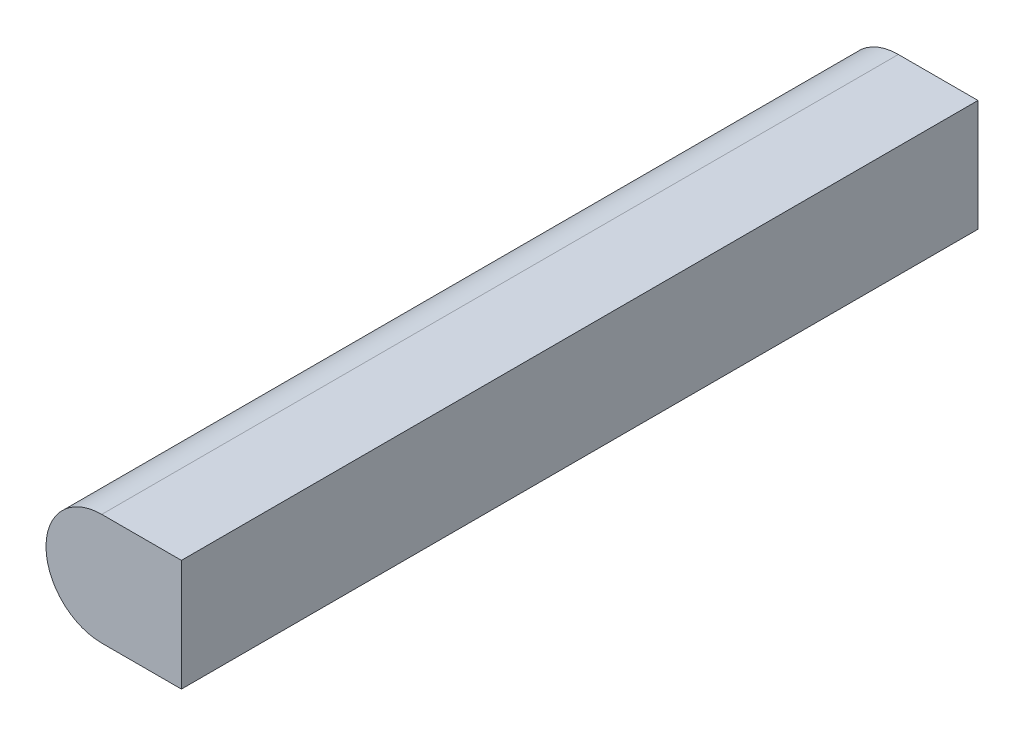
ISO-10303-21;
HEADER;
FILE_DESCRIPTION(('STEP AP214'),'2;1');
FILE_NAME('part.step','',(''),(''),'','','');
FILE_SCHEMA(('AUTOMOTIVE_DESIGN { 1 0 10303 214 1 1 1 1 }'));
ENDSEC;
DATA;
#1=APPLICATION_CONTEXT('core data for automotive mechanical design processes');
#2=APPLICATION_PROTOCOL_DEFINITION('international standard','automotive_design',2000,#1);
#3=PRODUCT_CONTEXT('',#1,'mechanical');
#4=PRODUCT('Part','Part','',(#3));
#5=PRODUCT_RELATED_PRODUCT_CATEGORY('part','',(#4));
#6=PRODUCT_DEFINITION_FORMATION('','',#4);
#7=PRODUCT_DEFINITION_CONTEXT('part definition',#1,'design');
#8=PRODUCT_DEFINITION('design','',#6,#7);
#9=PRODUCT_DEFINITION_SHAPE('','',#8);
#10=(LENGTH_UNIT() NAMED_UNIT(*) SI_UNIT(.MILLI.,.METRE.));
#11=(NAMED_UNIT(*) PLANE_ANGLE_UNIT() SI_UNIT($,.RADIAN.));
#12=(NAMED_UNIT(*) SI_UNIT($,.STERADIAN.) SOLID_ANGLE_UNIT());
#13=UNCERTAINTY_MEASURE_WITH_UNIT(LENGTH_MEASURE(1.E-05),#10,'distance_accuracy_value','');
#14=(GEOMETRIC_REPRESENTATION_CONTEXT(3) GLOBAL_UNCERTAINTY_ASSIGNED_CONTEXT((#13)) GLOBAL_UNIT_ASSIGNED_CONTEXT((#10,
#11,#12)) REPRESENTATION_CONTEXT('',''));
#15=CARTESIAN_POINT('',(0.,0.,0.));
#16=DIRECTION('',(0.,0.,1.));
#17=DIRECTION('',(1.,0.,0.));
#18=AXIS2_PLACEMENT_3D('',#15,#16,#17);
#19=CARTESIAN_POINT('',(0.,0.,100.));
#20=DIRECTION('',(0.,-1.,0.));
#21=DIRECTION('',(1.,0.,0.));
#22=AXIS2_PLACEMENT_3D('',#19,#20,#21);
#23=PLANE('',#22);
#24=DIRECTION('',(-1.,0.,0.));
#25=VECTOR('',#24,1.);
#26=CARTESIAN_POINT('',(0.,0.,0.));
#27=LINE('',#26,#25);
#28=CARTESIAN_POINT('',(10.,0.,0.));
#29=VERTEX_POINT('',#28);
#30=CARTESIAN_POINT('',(0.,0.,0.));
#31=VERTEX_POINT('',#30);
#32=EDGE_CURVE('E83',#29,#31,#27,.T.);
#33=ORIENTED_EDGE('',*,*,#32,.T.);
#34=DIRECTION('',(0.,0.,-1.));
#35=VECTOR('',#34,1.);
#36=CARTESIAN_POINT('',(0.,0.,100.));
#37=LINE('',#36,#35);
#38=CARTESIAN_POINT('',(0.,0.,100.));
#39=VERTEX_POINT('',#38);
#40=EDGE_CURVE('E11',#39,#31,#37,.T.);
#41=ORIENTED_EDGE('',*,*,#40,.F.);
#42=DIRECTION('',(-1.,0.,0.));
#43=VECTOR('',#42,1.);
#44=CARTESIAN_POINT('',(0.,0.,100.));
#45=LINE('',#44,#43);
#46=CARTESIAN_POINT('',(10.,0.,100.));
#47=VERTEX_POINT('',#46);
#48=EDGE_CURVE('E77',#47,#39,#45,.T.);
#49=ORIENTED_EDGE('',*,*,#48,.F.);
#50=DIRECTION('',(0.,0.,-1.));
#51=VECTOR('',#50,1.);
#52=CARTESIAN_POINT('',(10.,0.,100.));
#53=LINE('',#52,#51);
#54=EDGE_CURVE('E72',#47,#29,#53,.T.);
#55=ORIENTED_EDGE('',*,*,#54,.T.);
#56=EDGE_LOOP('',(#33,#41,#49,#55));
#57=FACE_BOUND('',#56,.T.);
#58=ADVANCED_FACE('F34',(#57),#23,.F.);
#59=CARTESIAN_POINT('',(0.,-14.,100.));
#60=DIRECTION('',(0.,1.,0.));
#61=DIRECTION('',(-1.,0.,0.));
#62=AXIS2_PLACEMENT_3D('',#59,#60,#61);
#63=PLANE('',#62);
#64=DIRECTION('',(1.,0.,0.));
#65=VECTOR('',#64,1.);
#66=CARTESIAN_POINT('',(0.,-14.,0.));
#67=LINE('',#66,#65);
#68=CARTESIAN_POINT('',(0.,-14.,0.));
#69=VERTEX_POINT('',#68);
#70=CARTESIAN_POINT('',(10.,-14.,0.));
#71=VERTEX_POINT('',#70);
#72=EDGE_CURVE('E64',#69,#71,#67,.T.);
#73=ORIENTED_EDGE('',*,*,#72,.T.);
#74=DIRECTION('',(0.,0.,-1.));
#75=VECTOR('',#74,1.);
#76=CARTESIAN_POINT('',(10.,-14.,100.));
#77=LINE('',#76,#75);
#78=CARTESIAN_POINT('',(10.,-14.,100.));
#79=VERTEX_POINT('',#78);
#80=EDGE_CURVE('E74',#79,#71,#77,.T.);
#81=ORIENTED_EDGE('',*,*,#80,.F.);
#82=DIRECTION('',(1.,0.,0.));
#83=VECTOR('',#82,1.);
#84=CARTESIAN_POINT('',(0.,-14.,100.));
#85=LINE('',#84,#83);
#86=CARTESIAN_POINT('',(0.,-14.,100.));
#87=VERTEX_POINT('',#86);
#88=EDGE_CURVE('E98',#87,#79,#85,.T.);
#89=ORIENTED_EDGE('',*,*,#88,.F.);
#90=DIRECTION('',(0.,0.,-1.));
#91=VECTOR('',#90,1.);
#92=CARTESIAN_POINT('',(0.,-14.,100.));
#93=LINE('',#92,#91);
#94=EDGE_CURVE('E42',#87,#69,#93,.T.);
#95=ORIENTED_EDGE('',*,*,#94,.T.);
#96=EDGE_LOOP('',(#73,#81,#89,#95));
#97=FACE_BOUND('',#96,.T.);
#98=ADVANCED_FACE('F97',(#97),#63,.F.);
#99=CARTESIAN_POINT('',(10.,0.,100.));
#100=DIRECTION('',(-1.,0.,0.));
#101=DIRECTION('',(0.,0.,1.));
#102=AXIS2_PLACEMENT_3D('',#99,#100,#101);
#103=PLANE('',#102);
#104=DIRECTION('',(0.,1.,0.));
#105=VECTOR('',#104,1.);
#106=CARTESIAN_POINT('',(10.,0.,0.));
#107=LINE('',#106,#105);
#108=EDGE_CURVE('E69',#71,#29,#107,.T.);
#109=ORIENTED_EDGE('',*,*,#108,.T.);
#110=ORIENTED_EDGE('',*,*,#54,.F.);
#111=DIRECTION('',(0.,1.,0.));
#112=VECTOR('',#111,1.);
#113=CARTESIAN_POINT('',(10.,0.,100.));
#114=LINE('',#113,#112);
#115=EDGE_CURVE('E50',#79,#47,#114,.T.);
#116=ORIENTED_EDGE('',*,*,#115,.F.);
#117=ORIENTED_EDGE('',*,*,#80,.T.);
#118=EDGE_LOOP('',(#109,#110,#116,#117));
#119=FACE_BOUND('',#118,.T.);
#120=ADVANCED_FACE('F71',(#119),#103,.F.);
#121=CARTESIAN_POINT('',(0.,0.,100.));
#122=DIRECTION('',(0.,0.,-1.));
#123=DIRECTION('',(-1.,0.,0.));
#124=AXIS2_PLACEMENT_3D('',#121,#122,#123);
#125=PLANE('',#124);
#126=ORIENTED_EDGE('',*,*,#48,.T.);
#127=CARTESIAN_POINT('',(0.,-7.,100.));
#128=DIRECTION('',(0.,0.,1.));
#129=DIRECTION('',(1.,0.,0.));
#130=AXIS2_PLACEMENT_3D('',#127,#128,#129);
#131=CIRCLE('',#130,7.);
#132=EDGE_CURVE('E90',#39,#87,#131,.T.);
#133=ORIENTED_EDGE('',*,*,#132,.T.);
#134=ORIENTED_EDGE('',*,*,#88,.T.);
#135=ORIENTED_EDGE('',*,*,#115,.T.);
#136=EDGE_LOOP('',(#126,#133,#134,#135));
#137=FACE_BOUND('',#136,.T.);
#138=ADVANCED_FACE('F104',(#137),#125,.F.);
#139=CARTESIAN_POINT('',(0.,0.,0.));
#140=DIRECTION('',(0.,0.,-1.));
#141=DIRECTION('',(-1.,0.,0.));
#142=AXIS2_PLACEMENT_3D('',#139,#140,#141);
#143=PLANE('',#142);
#144=ORIENTED_EDGE('',*,*,#72,.F.);
#145=CARTESIAN_POINT('',(0.,-7.,0.));
#146=DIRECTION('',(0.,0.,1.));
#147=DIRECTION('',(1.,0.,0.));
#148=AXIS2_PLACEMENT_3D('',#145,#146,#147);
#149=CIRCLE('',#148,7.);
#150=EDGE_CURVE('E87',#31,#69,#149,.T.);
#151=ORIENTED_EDGE('',*,*,#150,.F.);
#152=ORIENTED_EDGE('',*,*,#32,.F.);
#153=ORIENTED_EDGE('',*,*,#108,.F.);
#154=EDGE_LOOP('',(#144,#151,#152,#153));
#155=FACE_BOUND('',#154,.T.);
#156=ADVANCED_FACE('F86',(#155),#143,.T.);
#157=CARTESIAN_POINT('',(0.,-7.,0.));
#158=DIRECTION('',(0.,0.,1.));
#159=DIRECTION('',(1.,0.,0.));
#160=AXIS2_PLACEMENT_3D('',#157,#158,#159);
#161=CYLINDRICAL_SURFACE('',#160,7.);
#162=ORIENTED_EDGE('',*,*,#40,.T.);
#163=ORIENTED_EDGE('',*,*,#150,.T.);
#164=ORIENTED_EDGE('',*,*,#94,.F.);
#165=ORIENTED_EDGE('',*,*,#132,.F.);
#166=EDGE_LOOP('',(#162,#163,#164,#165));
#167=FACE_BOUND('',#166,.T.);
#168=ADVANCED_FACE('F102',(#167),#161,.T.);
#169=CLOSED_SHELL('',(#58,#98,#120,#138,#156,#168));
#170=MANIFOLD_SOLID_BREP('B2',#169);
#171=ADVANCED_BREP_SHAPE_REPRESENTATION('',(#18,#170),#14);
#172=SHAPE_DEFINITION_REPRESENTATION(#9,#171);
ENDSEC;
END-ISO-10303-21;
